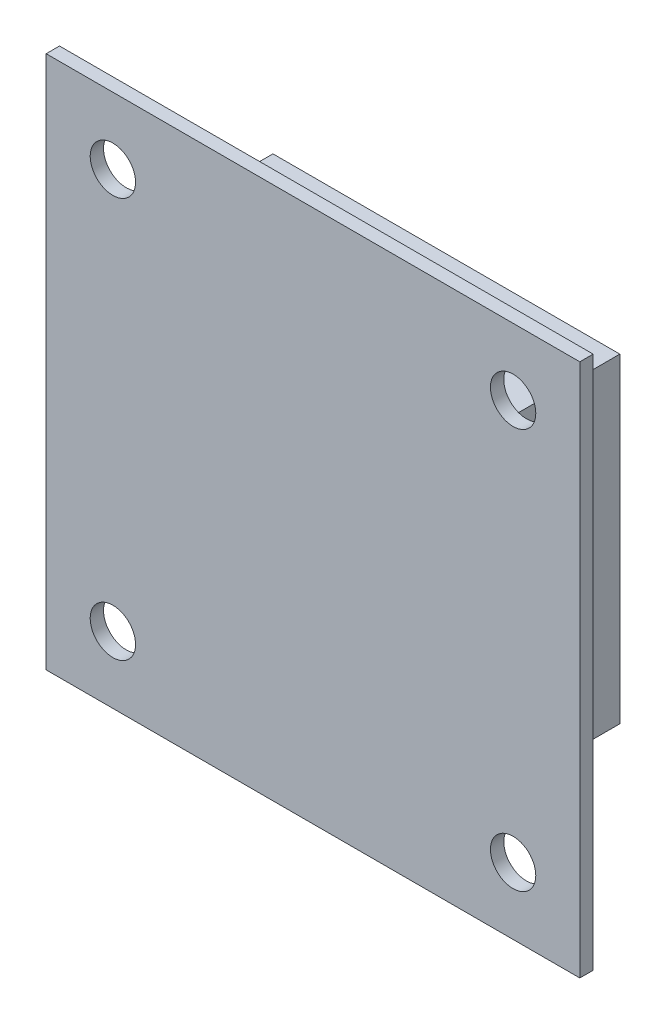
ISO-10303-21;
HEADER;
FILE_DESCRIPTION(('STEP AP214'),'2;1');
FILE_NAME('part.step','',(''),(''),'','','');
FILE_SCHEMA(('AUTOMOTIVE_DESIGN { 1 0 10303 214 1 1 1 1 }'));
ENDSEC;
DATA;
#1=APPLICATION_CONTEXT('core data for automotive mechanical design processes');
#2=APPLICATION_PROTOCOL_DEFINITION('international standard','automotive_design',2000,#1);
#3=PRODUCT_CONTEXT('',#1,'mechanical');
#4=PRODUCT('Part','Part','',(#3));
#5=PRODUCT_RELATED_PRODUCT_CATEGORY('part','',(#4));
#6=PRODUCT_DEFINITION_FORMATION('','',#4);
#7=PRODUCT_DEFINITION_CONTEXT('part definition',#1,'design');
#8=PRODUCT_DEFINITION('design','',#6,#7);
#9=PRODUCT_DEFINITION_SHAPE('','',#8);
#10=(LENGTH_UNIT() NAMED_UNIT(*) SI_UNIT(.MILLI.,.METRE.));
#11=(NAMED_UNIT(*) PLANE_ANGLE_UNIT() SI_UNIT($,.RADIAN.));
#12=(NAMED_UNIT(*) SI_UNIT($,.STERADIAN.) SOLID_ANGLE_UNIT());
#13=UNCERTAINTY_MEASURE_WITH_UNIT(LENGTH_MEASURE(1.E-05),#10,'distance_accuracy_value','');
#14=(GEOMETRIC_REPRESENTATION_CONTEXT(3) GLOBAL_UNCERTAINTY_ASSIGNED_CONTEXT((#13)) GLOBAL_UNIT_ASSIGNED_CONTEXT((#10,
#11,#12)) REPRESENTATION_CONTEXT('',''));
#15=CARTESIAN_POINT('',(0.,0.,0.));
#16=DIRECTION('',(0.,0.,1.));
#17=DIRECTION('',(1.,0.,0.));
#18=AXIS2_PLACEMENT_3D('',#15,#16,#17);
#19=CARTESIAN_POINT('',(0.,0.,0.));
#20=DIRECTION('',(0.,0.,-1.));
#21=DIRECTION('',(-1.,0.,0.));
#22=AXIS2_PLACEMENT_3D('',#19,#20,#21);
#23=PLANE('',#22);
#24=DIRECTION('',(0.,1.,0.));
#25=VECTOR('',#24,1.);
#26=CARTESIAN_POINT('',(20.,-20.,0.));
#27=LINE('',#26,#25);
#28=CARTESIAN_POINT('',(20.,-20.,0.));
#29=VERTEX_POINT('',#28);
#30=CARTESIAN_POINT('',(20.,20.,0.));
#31=VERTEX_POINT('',#30);
#32=EDGE_CURVE('E153',#29,#31,#27,.T.);
#33=ORIENTED_EDGE('',*,*,#32,.T.);
#34=DIRECTION('',(-1.,0.,0.));
#35=VECTOR('',#34,1.);
#36=CARTESIAN_POINT('',(-20.,20.,0.));
#37=LINE('',#36,#35);
#38=CARTESIAN_POINT('',(-20.,20.,0.));
#39=VERTEX_POINT('',#38);
#40=EDGE_CURVE('E168',#31,#39,#37,.T.);
#41=ORIENTED_EDGE('',*,*,#40,.T.);
#42=DIRECTION('',(0.,-1.,0.));
#43=VECTOR('',#42,1.);
#44=CARTESIAN_POINT('',(-20.,-20.,0.));
#45=LINE('',#44,#43);
#46=CARTESIAN_POINT('',(-20.,-20.,0.));
#47=VERTEX_POINT('',#46);
#48=EDGE_CURVE('E171',#39,#47,#45,.T.);
#49=ORIENTED_EDGE('',*,*,#48,.T.);
#50=DIRECTION('',(1.,0.,0.));
#51=VECTOR('',#50,1.);
#52=CARTESIAN_POINT('',(-20.,-20.,0.));
#53=LINE('',#52,#51);
#54=EDGE_CURVE('E158',#47,#29,#53,.T.);
#55=ORIENTED_EDGE('',*,*,#54,.T.);
#56=EDGE_LOOP('',(#33,#41,#49,#55));
#57=FACE_BOUND('',#56,.T.);
#58=CARTESIAN_POINT('',(-15.,-15.,1.2E-05));
#59=DIRECTION('',(0.,0.,1.));
#60=DIRECTION('',(1.,0.,0.));
#61=AXIS2_PLACEMENT_3D('',#58,#59,#60);
#62=CIRCLE('',#61,1.7);
#63=CARTESIAN_POINT('',(-13.3,-15.,1.2E-05));
#64=VERTEX_POINT('',#63);
#65=EDGE_CURVE('E188',#64,#64,#62,.T.);
#66=ORIENTED_EDGE('',*,*,#65,.F.);
#67=EDGE_LOOP('',(#66));
#68=FACE_BOUND('',#67,.T.);
#69=CARTESIAN_POINT('',(15.,15.,1.2E-05));
#70=DIRECTION('',(0.,0.,1.));
#71=DIRECTION('',(1.,0.,0.));
#72=AXIS2_PLACEMENT_3D('',#69,#70,#71);
#73=CIRCLE('',#72,1.7);
#74=CARTESIAN_POINT('',(16.7,15.,1.2E-05));
#75=VERTEX_POINT('',#74);
#76=EDGE_CURVE('E241',#75,#75,#73,.T.);
#77=ORIENTED_EDGE('',*,*,#76,.F.);
#78=EDGE_LOOP('',(#77));
#79=FACE_BOUND('',#78,.T.);
#80=CARTESIAN_POINT('',(15.,-15.,1.2E-05));
#81=DIRECTION('',(0.,0.,1.));
#82=DIRECTION('',(1.,0.,0.));
#83=AXIS2_PLACEMENT_3D('',#80,#81,#82);
#84=CIRCLE('',#83,1.7);
#85=CARTESIAN_POINT('',(16.7,-15.,1.2E-05));
#86=VERTEX_POINT('',#85);
#87=EDGE_CURVE('E227',#86,#86,#84,.T.);
#88=ORIENTED_EDGE('',*,*,#87,.F.);
#89=EDGE_LOOP('',(#88));
#90=FACE_BOUND('',#89,.T.);
#91=CARTESIAN_POINT('',(-15.,15.,1.2E-05));
#92=DIRECTION('',(0.,0.,1.));
#93=DIRECTION('',(1.,0.,0.));
#94=AXIS2_PLACEMENT_3D('',#91,#92,#93);
#95=CIRCLE('',#94,1.7);
#96=CARTESIAN_POINT('',(-13.3,15.,1.2E-05));
#97=VERTEX_POINT('',#96);
#98=EDGE_CURVE('E238',#97,#97,#95,.T.);
#99=ORIENTED_EDGE('',*,*,#98,.F.);
#100=EDGE_LOOP('',(#99));
#101=FACE_BOUND('',#100,.T.);
#102=ADVANCED_FACE('F39',(#57,#68,#79,#90,#101),#23,.F.);
#103=CARTESIAN_POINT('',(20.,-20.,-1.));
#104=DIRECTION('',(1.,0.,0.));
#105=DIRECTION('',(0.,0.,-1.));
#106=AXIS2_PLACEMENT_3D('',#103,#104,#105);
#107=PLANE('',#106);
#108=ORIENTED_EDGE('',*,*,#32,.F.);
#109=DIRECTION('',(0.,0.,1.));
#110=VECTOR('',#109,1.);
#111=CARTESIAN_POINT('',(20.,-20.,-1.));
#112=LINE('',#111,#110);
#113=CARTESIAN_POINT('',(20.,-20.,-1.));
#114=VERTEX_POINT('',#113);
#115=EDGE_CURVE('E11',#114,#29,#112,.T.);
#116=ORIENTED_EDGE('',*,*,#115,.F.);
#117=DIRECTION('',(0.,1.,0.));
#118=VECTOR('',#117,1.);
#119=CARTESIAN_POINT('',(20.,-20.,-1.));
#120=LINE('',#119,#118);
#121=CARTESIAN_POINT('',(20.,20.,-1.));
#122=VERTEX_POINT('',#121);
#123=EDGE_CURVE('E152',#114,#122,#120,.T.);
#124=ORIENTED_EDGE('',*,*,#123,.T.);
#125=DIRECTION('',(0.,0.,1.));
#126=VECTOR('',#125,1.);
#127=CARTESIAN_POINT('',(20.,20.,-1.));
#128=LINE('',#127,#126);
#129=EDGE_CURVE('E170',#122,#31,#128,.T.);
#130=ORIENTED_EDGE('',*,*,#129,.T.);
#131=EDGE_LOOP('',(#108,#116,#124,#130));
#132=FACE_BOUND('',#131,.T.);
#133=ADVANCED_FACE('F41',(#132),#107,.T.);
#134=CARTESIAN_POINT('',(-20.,-20.,-1.));
#135=DIRECTION('',(0.,-1.,0.));
#136=DIRECTION('',(0.,0.,-1.));
#137=AXIS2_PLACEMENT_3D('',#134,#135,#136);
#138=PLANE('',#137);
#139=ORIENTED_EDGE('',*,*,#54,.F.);
#140=DIRECTION('',(0.,0.,1.));
#141=VECTOR('',#140,1.);
#142=CARTESIAN_POINT('',(-20.,-20.,-1.));
#143=LINE('',#142,#141);
#144=CARTESIAN_POINT('',(-20.,-20.,-1.));
#145=VERTEX_POINT('',#144);
#146=EDGE_CURVE('E49',#145,#47,#143,.T.);
#147=ORIENTED_EDGE('',*,*,#146,.F.);
#148=DIRECTION('',(1.,0.,0.));
#149=VECTOR('',#148,1.);
#150=CARTESIAN_POINT('',(-20.,-20.,-1.));
#151=LINE('',#150,#149);
#152=EDGE_CURVE('E163',#145,#114,#151,.T.);
#153=ORIENTED_EDGE('',*,*,#152,.T.);
#154=ORIENTED_EDGE('',*,*,#115,.T.);
#155=EDGE_LOOP('',(#139,#147,#153,#154));
#156=FACE_BOUND('',#155,.T.);
#157=ADVANCED_FACE('F215',(#156),#138,.T.);
#158=CARTESIAN_POINT('',(-20.,-20.,-1.));
#159=DIRECTION('',(-1.,0.,0.));
#160=DIRECTION('',(0.,0.,1.));
#161=AXIS2_PLACEMENT_3D('',#158,#159,#160);
#162=PLANE('',#161);
#163=ORIENTED_EDGE('',*,*,#48,.F.);
#164=DIRECTION('',(0.,0.,1.));
#165=VECTOR('',#164,1.);
#166=CARTESIAN_POINT('',(-20.,20.,-1.));
#167=LINE('',#166,#165);
#168=CARTESIAN_POINT('',(-20.,20.,-1.));
#169=VERTEX_POINT('',#168);
#170=EDGE_CURVE('E179',#169,#39,#167,.T.);
#171=ORIENTED_EDGE('',*,*,#170,.F.);
#172=DIRECTION('',(0.,-1.,0.));
#173=VECTOR('',#172,1.);
#174=CARTESIAN_POINT('',(-20.,-20.,-1.));
#175=LINE('',#174,#173);
#176=EDGE_CURVE('E161',#169,#145,#175,.T.);
#177=ORIENTED_EDGE('',*,*,#176,.T.);
#178=ORIENTED_EDGE('',*,*,#146,.T.);
#179=EDGE_LOOP('',(#163,#171,#177,#178));
#180=FACE_BOUND('',#179,.T.);
#181=ADVANCED_FACE('F310',(#180),#162,.T.);
#182=CARTESIAN_POINT('',(-20.,20.,-1.));
#183=DIRECTION('',(0.,1.,0.));
#184=DIRECTION('',(0.,0.,1.));
#185=AXIS2_PLACEMENT_3D('',#182,#183,#184);
#186=PLANE('',#185);
#187=ORIENTED_EDGE('',*,*,#40,.F.);
#188=ORIENTED_EDGE('',*,*,#129,.F.);
#189=DIRECTION('',(-1.,0.,0.));
#190=VECTOR('',#189,1.);
#191=CARTESIAN_POINT('',(-20.,20.,-1.));
#192=LINE('',#191,#190);
#193=EDGE_CURVE('E160',#122,#169,#192,.T.);
#194=ORIENTED_EDGE('',*,*,#193,.T.);
#195=ORIENTED_EDGE('',*,*,#170,.T.);
#196=EDGE_LOOP('',(#187,#188,#194,#195));
#197=FACE_BOUND('',#196,.T.);
#198=ADVANCED_FACE('F302',(#197),#186,.T.);
#199=CARTESIAN_POINT('',(0.,0.,-1.));
#200=DIRECTION('',(0.,0.,-1.));
#201=DIRECTION('',(-1.,0.,0.));
#202=AXIS2_PLACEMENT_3D('',#199,#200,#201);
#203=PLANE('',#202);
#204=CARTESIAN_POINT('',(-15.,15.,-1.));
#205=DIRECTION('',(0.,0.,-1.));
#206=DIRECTION('',(-1.,0.,0.));
#207=AXIS2_PLACEMENT_3D('',#204,#205,#206);
#208=CIRCLE('',#207,1.7);
#209=CARTESIAN_POINT('',(-16.7,15.,-1.));
#210=VERTEX_POINT('',#209);
#211=EDGE_CURVE('E128',#210,#210,#208,.F.);
#212=ORIENTED_EDGE('',*,*,#211,.T.);
#213=EDGE_LOOP('',(#212));
#214=FACE_BOUND('',#213,.T.);
#215=CARTESIAN_POINT('',(15.,-15.,-1.));
#216=DIRECTION('',(0.,0.,-1.));
#217=DIRECTION('',(-1.,0.,0.));
#218=AXIS2_PLACEMENT_3D('',#215,#216,#217);
#219=CIRCLE('',#218,1.7);
#220=CARTESIAN_POINT('',(13.3,-15.,-1.));
#221=VERTEX_POINT('',#220);
#222=EDGE_CURVE('E131',#221,#221,#219,.F.);
#223=ORIENTED_EDGE('',*,*,#222,.T.);
#224=EDGE_LOOP('',(#223));
#225=FACE_BOUND('',#224,.T.);
#226=CARTESIAN_POINT('',(15.,15.,-1.));
#227=DIRECTION('',(0.,0.,-1.));
#228=DIRECTION('',(-1.,0.,0.));
#229=AXIS2_PLACEMENT_3D('',#226,#227,#228);
#230=CIRCLE('',#229,1.7);
#231=CARTESIAN_POINT('',(13.3,15.,-1.));
#232=VERTEX_POINT('',#231);
#233=EDGE_CURVE('E183',#232,#232,#230,.F.);
#234=ORIENTED_EDGE('',*,*,#233,.T.);
#235=EDGE_LOOP('',(#234));
#236=FACE_BOUND('',#235,.T.);
#237=CARTESIAN_POINT('',(-15.,-15.,-1.));
#238=DIRECTION('',(0.,0.,-1.));
#239=DIRECTION('',(-1.,0.,0.));
#240=AXIS2_PLACEMENT_3D('',#237,#238,#239);
#241=CIRCLE('',#240,1.7);
#242=CARTESIAN_POINT('',(-16.7,-15.,-1.));
#243=VERTEX_POINT('',#242);
#244=EDGE_CURVE('E185',#243,#243,#241,.F.);
#245=ORIENTED_EDGE('',*,*,#244,.T.);
#246=EDGE_LOOP('',(#245));
#247=FACE_BOUND('',#246,.T.);
#248=DIRECTION('',(0.,-1.,0.));
#249=VECTOR('',#248,1.);
#250=CARTESIAN_POINT('',(13.,0.,-1.));
#251=LINE('',#250,#249);
#252=CARTESIAN_POINT('',(13.,12.,-0.999999999999999));
#253=VERTEX_POINT('',#252);
#254=CARTESIAN_POINT('',(13.,-12.,-1.));
#255=VERTEX_POINT('',#254);
#256=EDGE_CURVE('E151',#253,#255,#251,.T.);
#257=ORIENTED_EDGE('',*,*,#256,.F.);
#258=DIRECTION('',(1.,0.,0.));
#259=VECTOR('',#258,1.);
#260=CARTESIAN_POINT('',(0.,12.,-1.));
#261=LINE('',#260,#259);
#262=CARTESIAN_POINT('',(-13.,12.,-1.));
#263=VERTEX_POINT('',#262);
#264=EDGE_CURVE('E112',#263,#253,#261,.T.);
#265=ORIENTED_EDGE('',*,*,#264,.F.);
#266=DIRECTION('',(0.,1.,0.));
#267=VECTOR('',#266,1.);
#268=CARTESIAN_POINT('',(-13.,0.,-1.));
#269=LINE('',#268,#267);
#270=CARTESIAN_POINT('',(-13.,-12.,-1.));
#271=VERTEX_POINT('',#270);
#272=EDGE_CURVE('E61',#271,#263,#269,.T.);
#273=ORIENTED_EDGE('',*,*,#272,.F.);
#274=DIRECTION('',(-1.,0.,0.));
#275=VECTOR('',#274,1.);
#276=CARTESIAN_POINT('',(0.,-12.,-1.));
#277=LINE('',#276,#275);
#278=EDGE_CURVE('E59',#255,#271,#277,.T.);
#279=ORIENTED_EDGE('',*,*,#278,.F.);
#280=EDGE_LOOP('',(#257,#265,#273,#279));
#281=FACE_BOUND('',#280,.T.);
#282=ORIENTED_EDGE('',*,*,#123,.F.);
#283=ORIENTED_EDGE('',*,*,#152,.F.);
#284=ORIENTED_EDGE('',*,*,#176,.F.);
#285=ORIENTED_EDGE('',*,*,#193,.F.);
#286=EDGE_LOOP('',(#282,#283,#284,#285));
#287=FACE_BOUND('',#286,.T.);
#288=ADVANCED_FACE('F209',(#214,#225,#236,#247,#281,#287),#203,.T.);
#289=CARTESIAN_POINT('',(13.,-12.,-10.));
#290=DIRECTION('',(1.,0.,0.));
#291=DIRECTION('',(0.,0.,-1.));
#292=AXIS2_PLACEMENT_3D('',#289,#290,#291);
#293=PLANE('',#292);
#294=DIRECTION('',(0.,0.,1.));
#295=VECTOR('',#294,1.);
#296=CARTESIAN_POINT('',(13.,12.,-10.));
#297=LINE('',#296,#295);
#298=CARTESIAN_POINT('',(13.,12.,-10.));
#299=VERTEX_POINT('',#298);
#300=EDGE_CURVE('E106',#299,#253,#297,.T.);
#301=ORIENTED_EDGE('',*,*,#300,.T.);
#302=ORIENTED_EDGE('',*,*,#256,.T.);
#303=DIRECTION('',(0.,0.,1.));
#304=VECTOR('',#303,1.);
#305=CARTESIAN_POINT('',(13.,-12.,-10.));
#306=LINE('',#305,#304);
#307=CARTESIAN_POINT('',(13.,-12.,-10.));
#308=VERTEX_POINT('',#307);
#309=EDGE_CURVE('E129',#308,#255,#306,.T.);
#310=ORIENTED_EDGE('',*,*,#309,.F.);
#311=DIRECTION('',(0.,1.,0.));
#312=VECTOR('',#311,1.);
#313=CARTESIAN_POINT('',(13.,-12.,-10.));
#314=LINE('',#313,#312);
#315=EDGE_CURVE('E125',#308,#299,#314,.T.);
#316=ORIENTED_EDGE('',*,*,#315,.T.);
#317=EDGE_LOOP('',(#301,#302,#310,#316));
#318=FACE_BOUND('',#317,.T.);
#319=ADVANCED_FACE('F130',(#318),#293,.T.);
#320=CARTESIAN_POINT('',(-13.,-12.,-10.));
#321=DIRECTION('',(0.,-1.,0.));
#322=DIRECTION('',(0.,0.,-1.));
#323=AXIS2_PLACEMENT_3D('',#320,#321,#322);
#324=PLANE('',#323);
#325=ORIENTED_EDGE('',*,*,#309,.T.);
#326=ORIENTED_EDGE('',*,*,#278,.T.);
#327=DIRECTION('',(0.,0.,1.));
#328=VECTOR('',#327,1.);
#329=CARTESIAN_POINT('',(-13.,-12.,-10.));
#330=LINE('',#329,#328);
#331=CARTESIAN_POINT('',(-13.,-12.,-10.));
#332=VERTEX_POINT('',#331);
#333=EDGE_CURVE('E145',#332,#271,#330,.T.);
#334=ORIENTED_EDGE('',*,*,#333,.F.);
#335=DIRECTION('',(1.,0.,0.));
#336=VECTOR('',#335,1.);
#337=CARTESIAN_POINT('',(-13.,-12.,-10.));
#338=LINE('',#337,#336);
#339=EDGE_CURVE('E113',#332,#308,#338,.T.);
#340=ORIENTED_EDGE('',*,*,#339,.T.);
#341=EDGE_LOOP('',(#325,#326,#334,#340));
#342=FACE_BOUND('',#341,.T.);
#343=ADVANCED_FACE('F292',(#342),#324,.T.);
#344=CARTESIAN_POINT('',(-13.,-12.,-10.));
#345=DIRECTION('',(-1.,0.,0.));
#346=DIRECTION('',(0.,0.,1.));
#347=AXIS2_PLACEMENT_3D('',#344,#345,#346);
#348=PLANE('',#347);
#349=ORIENTED_EDGE('',*,*,#333,.T.);
#350=ORIENTED_EDGE('',*,*,#272,.T.);
#351=DIRECTION('',(0.,0.,1.));
#352=VECTOR('',#351,1.);
#353=CARTESIAN_POINT('',(-13.,12.,-10.));
#354=LINE('',#353,#352);
#355=CARTESIAN_POINT('',(-13.,12.,-10.));
#356=VERTEX_POINT('',#355);
#357=EDGE_CURVE('E111',#356,#263,#354,.T.);
#358=ORIENTED_EDGE('',*,*,#357,.F.);
#359=DIRECTION('',(0.,-1.,0.));
#360=VECTOR('',#359,1.);
#361=CARTESIAN_POINT('',(-13.,-12.,-10.));
#362=LINE('',#361,#360);
#363=EDGE_CURVE('E122',#356,#332,#362,.T.);
#364=ORIENTED_EDGE('',*,*,#363,.T.);
#365=EDGE_LOOP('',(#349,#350,#358,#364));
#366=FACE_BOUND('',#365,.T.);
#367=ADVANCED_FACE('F294',(#366),#348,.T.);
#368=CARTESIAN_POINT('',(-13.,12.,-10.));
#369=DIRECTION('',(0.,1.,0.));
#370=DIRECTION('',(0.,0.,1.));
#371=AXIS2_PLACEMENT_3D('',#368,#369,#370);
#372=PLANE('',#371);
#373=ORIENTED_EDGE('',*,*,#357,.T.);
#374=ORIENTED_EDGE('',*,*,#264,.T.);
#375=ORIENTED_EDGE('',*,*,#300,.F.);
#376=DIRECTION('',(-1.,0.,0.));
#377=VECTOR('',#376,1.);
#378=CARTESIAN_POINT('',(-13.,12.,-10.));
#379=LINE('',#378,#377);
#380=EDGE_CURVE('E109',#299,#356,#379,.T.);
#381=ORIENTED_EDGE('',*,*,#380,.T.);
#382=EDGE_LOOP('',(#373,#374,#375,#381));
#383=FACE_BOUND('',#382,.T.);
#384=ADVANCED_FACE('F108',(#383),#372,.T.);
#385=CARTESIAN_POINT('',(0.,0.,-10.));
#386=DIRECTION('',(0.,0.,-1.));
#387=DIRECTION('',(-1.,0.,0.));
#388=AXIS2_PLACEMENT_3D('',#385,#386,#387);
#389=PLANE('',#388);
#390=ORIENTED_EDGE('',*,*,#315,.F.);
#391=ORIENTED_EDGE('',*,*,#339,.F.);
#392=ORIENTED_EDGE('',*,*,#363,.F.);
#393=ORIENTED_EDGE('',*,*,#380,.F.);
#394=EDGE_LOOP('',(#390,#391,#392,#393));
#395=FACE_BOUND('',#394,.T.);
#396=ADVANCED_FACE('F119',(#395),#389,.T.);
#397=CARTESIAN_POINT('',(-15.,-15.,1.2E-05));
#398=DIRECTION('',(0.,0.,-1.));
#399=DIRECTION('',(-1.,0.,0.));
#400=AXIS2_PLACEMENT_3D('',#397,#398,#399);
#401=CYLINDRICAL_SURFACE('',#400,1.7);
#402=ORIENTED_EDGE('',*,*,#244,.F.);
#403=EDGE_LOOP('',(#402));
#404=FACE_BOUND('',#403,.T.);
#405=ORIENTED_EDGE('',*,*,#65,.T.);
#406=EDGE_LOOP('',(#405));
#407=FACE_BOUND('',#406,.T.);
#408=ADVANCED_FACE('F268',(#404,#407),#401,.F.);
#409=CARTESIAN_POINT('',(15.,15.,1.2E-05));
#410=DIRECTION('',(0.,0.,-1.));
#411=DIRECTION('',(-1.,0.,0.));
#412=AXIS2_PLACEMENT_3D('',#409,#410,#411);
#413=CYLINDRICAL_SURFACE('',#412,1.7);
#414=ORIENTED_EDGE('',*,*,#233,.F.);
#415=EDGE_LOOP('',(#414));
#416=FACE_BOUND('',#415,.T.);
#417=ORIENTED_EDGE('',*,*,#76,.T.);
#418=EDGE_LOOP('',(#417));
#419=FACE_BOUND('',#418,.T.);
#420=ADVANCED_FACE('F249',(#416,#419),#413,.F.);
#421=CARTESIAN_POINT('',(15.,-15.,1.2E-05));
#422=DIRECTION('',(0.,0.,-1.));
#423=DIRECTION('',(-1.,0.,0.));
#424=AXIS2_PLACEMENT_3D('',#421,#422,#423);
#425=CYLINDRICAL_SURFACE('',#424,1.7);
#426=ORIENTED_EDGE('',*,*,#222,.F.);
#427=EDGE_LOOP('',(#426));
#428=FACE_BOUND('',#427,.T.);
#429=ORIENTED_EDGE('',*,*,#87,.T.);
#430=EDGE_LOOP('',(#429));
#431=FACE_BOUND('',#430,.T.);
#432=ADVANCED_FACE('F270',(#428,#431),#425,.F.);
#433=CARTESIAN_POINT('',(-15.,15.,1.2E-05));
#434=DIRECTION('',(0.,0.,-1.));
#435=DIRECTION('',(-1.,0.,0.));
#436=AXIS2_PLACEMENT_3D('',#433,#434,#435);
#437=CYLINDRICAL_SURFACE('',#436,1.7);
#438=ORIENTED_EDGE('',*,*,#211,.F.);
#439=EDGE_LOOP('',(#438));
#440=FACE_BOUND('',#439,.T.);
#441=ORIENTED_EDGE('',*,*,#98,.T.);
#442=EDGE_LOOP('',(#441));
#443=FACE_BOUND('',#442,.T.);
#444=ADVANCED_FACE('F269',(#440,#443),#437,.F.);
#445=CLOSED_SHELL('',(#102,#133,#157,#181,#198,#288,#319,#343,#367,#384,#396,#408,#420,#432,#444));
#446=MANIFOLD_SOLID_BREP('B2',#445);
#447=ADVANCED_BREP_SHAPE_REPRESENTATION('',(#18,#446),#14);
#448=SHAPE_DEFINITION_REPRESENTATION(#9,#447);
ENDSEC;
END-ISO-10303-21;
